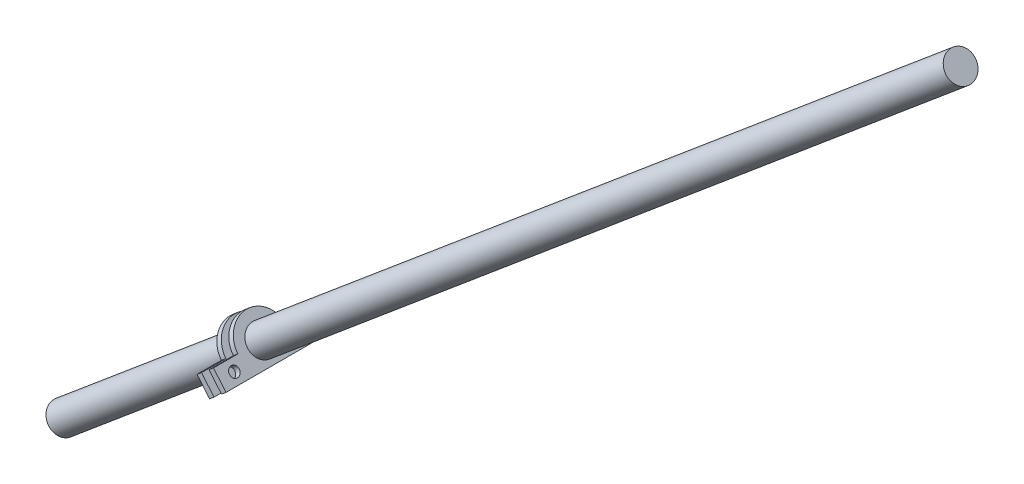
ISO-10303-21;
HEADER;
FILE_DESCRIPTION(('STEP AP214'),'2;1');
FILE_NAME('part.step','',(''),(''),'','','');
FILE_SCHEMA(('AUTOMOTIVE_DESIGN { 1 0 10303 214 1 1 1 1 }'));
ENDSEC;
DATA;
#1=APPLICATION_CONTEXT('core data for automotive mechanical design processes');
#2=APPLICATION_PROTOCOL_DEFINITION('international standard','automotive_design',2000,#1);
#3=PRODUCT_CONTEXT('',#1,'mechanical');
#4=PRODUCT('Part','Part','',(#3));
#5=PRODUCT_RELATED_PRODUCT_CATEGORY('part','',(#4));
#6=PRODUCT_DEFINITION_FORMATION('','',#4);
#7=PRODUCT_DEFINITION_CONTEXT('part definition',#1,'design');
#8=PRODUCT_DEFINITION('design','',#6,#7);
#9=PRODUCT_DEFINITION_SHAPE('','',#8);
#10=(LENGTH_UNIT() NAMED_UNIT(*) SI_UNIT(.MILLI.,.METRE.));
#11=(NAMED_UNIT(*) PLANE_ANGLE_UNIT() SI_UNIT($,.RADIAN.));
#12=(NAMED_UNIT(*) SI_UNIT($,.STERADIAN.) SOLID_ANGLE_UNIT());
#13=UNCERTAINTY_MEASURE_WITH_UNIT(LENGTH_MEASURE(1.E-05),#10,'distance_accuracy_value','');
#14=(GEOMETRIC_REPRESENTATION_CONTEXT(3) GLOBAL_UNCERTAINTY_ASSIGNED_CONTEXT((#13)) GLOBAL_UNIT_ASSIGNED_CONTEXT((#10,
#11,#12)) REPRESENTATION_CONTEXT('',''));
#15=CARTESIAN_POINT('',(0.,0.,0.));
#16=DIRECTION('',(0.,0.,1.));
#17=DIRECTION('',(1.,0.,0.));
#18=AXIS2_PLACEMENT_3D('',#15,#16,#17);
#19=CARTESIAN_POINT('',(0.,0.,0.));
#20=DIRECTION('',(0.766044443118977,0.642787609686541,0.));
#21=DIRECTION('',(-0.642787609686541,0.766044443118977,0.));
#22=AXIS2_PLACEMENT_3D('',#19,#20,#21);
#23=PLANE('',#22);
#24=CARTESIAN_POINT('',(0.,0.,0.));
#25=DIRECTION('',(0.766044443118977,0.642787609686541,0.));
#26=DIRECTION('',(-0.642787609686541,0.766044443118977,0.));
#27=AXIS2_PLACEMENT_3D('',#24,#25,#26);
#28=CIRCLE('',#27,7.5);
#29=CARTESIAN_POINT('',(-4.82090707264906,5.74533332339232,0.));
#30=VERTEX_POINT('',#29);
#31=EDGE_CURVE('E158',#30,#30,#28,.T.);
#32=ORIENTED_EDGE('',*,*,#31,.F.);
#33=EDGE_LOOP('',(#32));
#34=FACE_BOUND('',#33,.T.);
#35=ADVANCED_FACE('F47',(#34),#23,.F.);
#36=CARTESIAN_POINT('',(0.,0.,0.));
#37=DIRECTION('',(0.766044443118977,0.642787609686541,0.));
#38=DIRECTION('',(-0.642787609686541,0.766044443118977,0.));
#39=AXIS2_PLACEMENT_3D('',#36,#37,#38);
#40=CYLINDRICAL_SURFACE('',#39,7.5);
#41=CARTESIAN_POINT('',(93.4574220605152,78.420088381758,0.));
#42=DIRECTION('',(-0.766044443118977,-0.642787609686541,0.));
#43=DIRECTION('',(0.642787609686541,-0.766044443118977,0.));
#44=AXIS2_PLACEMENT_3D('',#41,#42,#43);
#45=CIRCLE('',#44,7.5);
#46=CARTESIAN_POINT('',(98.2783291331642,72.6747550583657,0.));
#47=VERTEX_POINT('',#46);
#48=EDGE_CURVE('E55',#47,#47,#45,.F.);
#49=ORIENTED_EDGE('',*,*,#48,.F.);
#50=EDGE_LOOP('',(#49));
#51=FACE_BOUND('',#50,.T.);
#52=ORIENTED_EDGE('',*,*,#31,.T.);
#53=EDGE_LOOP('',(#52));
#54=FACE_BOUND('',#53,.T.);
#55=ADVANCED_FACE('F223',(#51,#54),#40,.T.);
#56=CARTESIAN_POINT('',(93.4574220605152,78.420088381758,0.));
#57=DIRECTION('',(-0.766044443118977,-0.642787609686541,0.));
#58=DIRECTION('',(0.642787609686541,-0.766044443118977,0.));
#59=AXIS2_PLACEMENT_3D('',#56,#57,#58);
#60=PLANE('',#59);
#61=ORIENTED_EDGE('',*,*,#48,.T.);
#62=EDGE_LOOP('',(#61));
#63=FACE_BOUND('',#62,.T.);
#64=CARTESIAN_POINT('',(96.6713601089479,74.5898661661631,17.5));
#65=DIRECTION('',(-0.766044443118977,-0.642787609686541,0.));
#66=DIRECTION('',(0.642787609686541,-0.766044443118977,0.));
#67=AXIS2_PLACEMENT_3D('',#64,#65,#66);
#68=CIRCLE('',#67,2.5);
#69=CARTESIAN_POINT('',(98.2783291331642,72.6747550583657,17.5));
#70=VERTEX_POINT('',#69);
#71=EDGE_CURVE('E141',#70,#70,#68,.T.);
#72=ORIENTED_EDGE('',*,*,#71,.F.);
#73=EDGE_LOOP('',(#72));
#74=FACE_BOUND('',#73,.T.);
#75=DIRECTION('',(-0.642787609686541,0.766044443118977,0.));
#76=VECTOR('',#75,1.);
#77=CARTESIAN_POINT('',(99.8852981573806,70.7596439505682,25.));
#78=LINE('',#77,#76);
#79=CARTESIAN_POINT('',(99.8852981573806,70.7596439505682,25.));
#80=VERTEX_POINT('',#79);
#81=CARTESIAN_POINT('',(93.4574220605152,78.420088381758,25.));
#82=VERTEX_POINT('',#81);
#83=EDGE_CURVE('E148',#80,#82,#78,.T.);
#84=ORIENTED_EDGE('',*,*,#83,.T.);
#85=DIRECTION('',(0.,0.,-1.));
#86=VECTOR('',#85,1.);
#87=CARTESIAN_POINT('',(93.4574220605152,78.420088381758,25.));
#88=LINE('',#87,#86);
#89=CARTESIAN_POINT('',(93.4574220605152,78.420088381758,12.5));
#90=VERTEX_POINT('',#89);
#91=EDGE_CURVE('E102',#82,#90,#88,.T.);
#92=ORIENTED_EDGE('',*,*,#91,.T.);
#93=CARTESIAN_POINT('',(93.4574220605152,78.420088381758,0.));
#94=DIRECTION('',(-0.766044443118977,-0.642787609686541,0.));
#95=DIRECTION('',(0.642787609686541,-0.766044443118977,0.));
#96=AXIS2_PLACEMENT_3D('',#93,#94,#95);
#97=CIRCLE('',#96,12.5);
#98=CARTESIAN_POINT('',(93.4574220605152,78.420088381758,-12.5));
#99=VERTEX_POINT('',#98);
#100=EDGE_CURVE('E119',#90,#99,#97,.T.);
#101=ORIENTED_EDGE('',*,*,#100,.T.);
#102=DIRECTION('',(0.,0.,-1.));
#103=VECTOR('',#102,1.);
#104=CARTESIAN_POINT('',(93.4574220605152,78.420088381758,-25.));
#105=LINE('',#104,#103);
#106=CARTESIAN_POINT('',(93.4574220605152,78.420088381758,-25.));
#107=VERTEX_POINT('',#106);
#108=EDGE_CURVE('E112',#99,#107,#105,.T.);
#109=ORIENTED_EDGE('',*,*,#108,.T.);
#110=DIRECTION('',(0.642787609686541,-0.766044443118977,0.));
#111=VECTOR('',#110,1.);
#112=CARTESIAN_POINT('',(99.8852981573806,70.7596439505682,-25.));
#113=LINE('',#112,#111);
#114=CARTESIAN_POINT('',(99.8852981573806,70.7596439505682,-25.));
#115=VERTEX_POINT('',#114);
#116=EDGE_CURVE('E117',#107,#115,#113,.T.);
#117=ORIENTED_EDGE('',*,*,#116,.T.);
#118=DIRECTION('',(0.,0.,1.));
#119=VECTOR('',#118,1.);
#120=CARTESIAN_POINT('',(99.8852981573806,70.7596439505682,-25.));
#121=LINE('',#120,#119);
#122=EDGE_CURVE('E63',#115,#80,#121,.T.);
#123=ORIENTED_EDGE('',*,*,#122,.T.);
#124=EDGE_LOOP('',(#84,#92,#101,#109,#117,#123));
#125=FACE_BOUND('',#124,.T.);
#126=CARTESIAN_POINT('',(96.6713601089479,74.5898661661631,-17.5));
#127=DIRECTION('',(-0.766044443118977,-0.642787609686541,0.));
#128=DIRECTION('',(-0.642787609686541,0.766044443118977,0.));
#129=AXIS2_PLACEMENT_3D('',#126,#127,#128);
#130=CIRCLE('',#129,2.5);
#131=CARTESIAN_POINT('',(95.0643910847315,76.5049772739605,-17.5));
#132=VERTEX_POINT('',#131);
#133=EDGE_CURVE('E174',#132,#132,#130,.T.);
#134=ORIENTED_EDGE('',*,*,#133,.F.);
#135=EDGE_LOOP('',(#134));
#136=FACE_BOUND('',#135,.T.);
#137=ADVANCED_FACE('F114',(#63,#74,#125,#136),#60,.T.);
#138=CARTESIAN_POINT('',(95.7555553898721,80.3484512108176,0.));
#139=DIRECTION('',(-0.766044443118977,-0.642787609686541,0.));
#140=DIRECTION('',(0.642787609686541,-0.766044443118977,0.));
#141=AXIS2_PLACEMENT_3D('',#138,#139,#140);
#142=PLANE('',#141);
#143=CARTESIAN_POINT('',(95.7555553898721,80.3484512108176,0.));
#144=DIRECTION('',(-0.766044443118977,-0.642787609686541,0.));
#145=DIRECTION('',(0.642787609686541,-0.766044443118977,0.));
#146=AXIS2_PLACEMENT_3D('',#143,#144,#145);
#147=CIRCLE('',#146,7.5);
#148=CARTESIAN_POINT('',(100.576462462521,74.6031178874253,0.));
#149=VERTEX_POINT('',#148);
#150=EDGE_CURVE('E157',#149,#149,#147,.F.);
#151=ORIENTED_EDGE('',*,*,#150,.F.);
#152=EDGE_LOOP('',(#151));
#153=FACE_BOUND('',#152,.T.);
#154=DIRECTION('',(-0.642787609686541,0.766044443118977,0.));
#155=VECTOR('',#154,1.);
#156=CARTESIAN_POINT('',(102.183431486738,72.6880067796279,25.));
#157=LINE('',#156,#155);
#158=CARTESIAN_POINT('',(102.183431486738,72.6880067796279,25.));
#159=VERTEX_POINT('',#158);
#160=CARTESIAN_POINT('',(95.7555553898721,80.3484512108176,25.));
#161=VERTEX_POINT('',#160);
#162=EDGE_CURVE('E137',#159,#161,#157,.T.);
#163=ORIENTED_EDGE('',*,*,#162,.F.);
#164=DIRECTION('',(0.,0.,1.));
#165=VECTOR('',#164,1.);
#166=CARTESIAN_POINT('',(102.183431486738,72.6880067796279,-25.));
#167=LINE('',#166,#165);
#168=CARTESIAN_POINT('',(102.183431486738,72.6880067796279,-25.));
#169=VERTEX_POINT('',#168);
#170=EDGE_CURVE('E93',#169,#159,#167,.T.);
#171=ORIENTED_EDGE('',*,*,#170,.F.);
#172=DIRECTION('',(0.642787609686541,-0.766044443118977,0.));
#173=VECTOR('',#172,1.);
#174=CARTESIAN_POINT('',(102.183431486738,72.6880067796279,-25.));
#175=LINE('',#174,#173);
#176=CARTESIAN_POINT('',(95.7555553898721,80.3484512108176,-25.));
#177=VERTEX_POINT('',#176);
#178=EDGE_CURVE('E87',#177,#169,#175,.T.);
#179=ORIENTED_EDGE('',*,*,#178,.F.);
#180=DIRECTION('',(0.,0.,-1.));
#181=VECTOR('',#180,1.);
#182=CARTESIAN_POINT('',(95.7555553898721,80.3484512108176,-25.));
#183=LINE('',#182,#181);
#184=CARTESIAN_POINT('',(95.7555553898721,80.3484512108176,-12.5));
#185=VERTEX_POINT('',#184);
#186=EDGE_CURVE('E127',#185,#177,#183,.T.);
#187=ORIENTED_EDGE('',*,*,#186,.F.);
#188=CARTESIAN_POINT('',(95.7555553898721,80.3484512108176,0.));
#189=DIRECTION('',(-0.766044443118977,-0.642787609686541,0.));
#190=DIRECTION('',(0.642787609686541,-0.766044443118977,0.));
#191=AXIS2_PLACEMENT_3D('',#188,#189,#190);
#192=CIRCLE('',#191,12.5);
#193=CARTESIAN_POINT('',(95.7555553898721,80.3484512108176,12.5));
#194=VERTEX_POINT('',#193);
#195=EDGE_CURVE('E143',#194,#185,#192,.T.);
#196=ORIENTED_EDGE('',*,*,#195,.F.);
#197=DIRECTION('',(0.,0.,-1.));
#198=VECTOR('',#197,1.);
#199=CARTESIAN_POINT('',(95.7555553898721,80.3484512108176,25.));
#200=LINE('',#199,#198);
#201=EDGE_CURVE('E140',#161,#194,#200,.T.);
#202=ORIENTED_EDGE('',*,*,#201,.F.);
#203=EDGE_LOOP('',(#163,#171,#179,#187,#196,#202));
#204=FACE_BOUND('',#203,.T.);
#205=CARTESIAN_POINT('',(98.9694934383048,76.5182289952227,17.5));
#206=DIRECTION('',(-0.766044443118977,-0.642787609686541,0.));
#207=DIRECTION('',(0.642787609686541,-0.766044443118977,0.));
#208=AXIS2_PLACEMENT_3D('',#205,#206,#207);
#209=CIRCLE('',#208,2.5);
#210=CARTESIAN_POINT('',(100.576462462521,74.6031178874253,17.5));
#211=VERTEX_POINT('',#210);
#212=EDGE_CURVE('E191',#211,#211,#209,.T.);
#213=ORIENTED_EDGE('',*,*,#212,.T.);
#214=EDGE_LOOP('',(#213));
#215=FACE_BOUND('',#214,.T.);
#216=CARTESIAN_POINT('',(98.9694934383048,76.5182289952227,-17.5));
#217=DIRECTION('',(-0.766044443118977,-0.642787609686541,0.));
#218=DIRECTION('',(-0.642787609686541,0.766044443118977,0.));
#219=AXIS2_PLACEMENT_3D('',#216,#217,#218);
#220=CIRCLE('',#219,2.5);
#221=CARTESIAN_POINT('',(97.3625244140885,78.4333401030202,-17.5));
#222=VERTEX_POINT('',#221);
#223=EDGE_CURVE('E169',#222,#222,#220,.T.);
#224=ORIENTED_EDGE('',*,*,#223,.T.);
#225=EDGE_LOOP('',(#224));
#226=FACE_BOUND('',#225,.T.);
#227=ADVANCED_FACE('F206',(#153,#204,#215,#226),#142,.F.);
#228=CARTESIAN_POINT('',(99.8852981573806,70.7596439505682,25.));
#229=DIRECTION('',(0.,0.,-1.));
#230=DIRECTION('',(-1.,0.,0.));
#231=AXIS2_PLACEMENT_3D('',#228,#229,#230);
#232=PLANE('',#231);
#233=ORIENTED_EDGE('',*,*,#162,.T.);
#234=DIRECTION('',(0.766044443118977,0.642787609686541,0.));
#235=VECTOR('',#234,1.);
#236=CARTESIAN_POINT('',(93.4574220605152,78.420088381758,25.));
#237=LINE('',#236,#235);
#238=EDGE_CURVE('E155',#82,#161,#237,.T.);
#239=ORIENTED_EDGE('',*,*,#238,.F.);
#240=ORIENTED_EDGE('',*,*,#83,.F.);
#241=DIRECTION('',(0.766044443118977,0.642787609686541,0.));
#242=VECTOR('',#241,1.);
#243=CARTESIAN_POINT('',(99.8852981573806,70.7596439505682,25.));
#244=LINE('',#243,#242);
#245=EDGE_CURVE('E133',#80,#159,#244,.T.);
#246=ORIENTED_EDGE('',*,*,#245,.T.);
#247=EDGE_LOOP('',(#233,#239,#240,#246));
#248=FACE_BOUND('',#247,.T.);
#249=ADVANCED_FACE('F209',(#248),#232,.F.);
#250=CARTESIAN_POINT('',(93.4574220605152,78.420088381758,25.));
#251=DIRECTION('',(0.642787609686541,-0.766044443118977,0.));
#252=DIRECTION('',(0.766044443118977,0.642787609686541,0.));
#253=AXIS2_PLACEMENT_3D('',#250,#251,#252);
#254=PLANE('',#253);
#255=ORIENTED_EDGE('',*,*,#201,.T.);
#256=DIRECTION('',(0.766044443118977,0.642787609686541,0.));
#257=VECTOR('',#256,1.);
#258=CARTESIAN_POINT('',(93.4574220605152,78.420088381758,12.5));
#259=LINE('',#258,#257);
#260=EDGE_CURVE('E152',#90,#194,#259,.T.);
#261=ORIENTED_EDGE('',*,*,#260,.F.);
#262=ORIENTED_EDGE('',*,*,#91,.F.);
#263=ORIENTED_EDGE('',*,*,#238,.T.);
#264=EDGE_LOOP('',(#255,#261,#262,#263));
#265=FACE_BOUND('',#264,.T.);
#266=ADVANCED_FACE('F200',(#265),#254,.F.);
#267=CARTESIAN_POINT('',(93.4574220605152,78.420088381758,0.));
#268=DIRECTION('',(0.766044443118977,0.642787609686541,0.));
#269=DIRECTION('',(-0.642787609686541,0.766044443118977,0.));
#270=AXIS2_PLACEMENT_3D('',#267,#268,#269);
#271=CYLINDRICAL_SURFACE('',#270,12.5);
#272=ORIENTED_EDGE('',*,*,#195,.T.);
#273=DIRECTION('',(0.766044443118977,0.642787609686541,0.));
#274=VECTOR('',#273,1.);
#275=CARTESIAN_POINT('',(93.4574220605152,78.420088381758,-12.5));
#276=LINE('',#275,#274);
#277=EDGE_CURVE('E128',#99,#185,#276,.T.);
#278=ORIENTED_EDGE('',*,*,#277,.F.);
#279=ORIENTED_EDGE('',*,*,#100,.F.);
#280=ORIENTED_EDGE('',*,*,#260,.T.);
#281=EDGE_LOOP('',(#272,#278,#279,#280));
#282=FACE_BOUND('',#281,.T.);
#283=ADVANCED_FACE('F203',(#282),#271,.T.);
#284=CARTESIAN_POINT('',(93.4574220605152,78.420088381758,-25.));
#285=DIRECTION('',(0.642787609686541,-0.766044443118977,0.));
#286=DIRECTION('',(0.766044443118977,0.642787609686541,0.));
#287=AXIS2_PLACEMENT_3D('',#284,#285,#286);
#288=PLANE('',#287);
#289=ORIENTED_EDGE('',*,*,#186,.T.);
#290=DIRECTION('',(0.766044443118977,0.642787609686541,0.));
#291=VECTOR('',#290,1.);
#292=CARTESIAN_POINT('',(93.4574220605152,78.420088381758,-25.));
#293=LINE('',#292,#291);
#294=EDGE_CURVE('E124',#107,#177,#293,.T.);
#295=ORIENTED_EDGE('',*,*,#294,.F.);
#296=ORIENTED_EDGE('',*,*,#108,.F.);
#297=ORIENTED_EDGE('',*,*,#277,.T.);
#298=EDGE_LOOP('',(#289,#295,#296,#297));
#299=FACE_BOUND('',#298,.T.);
#300=ADVANCED_FACE('F125',(#299),#288,.F.);
#301=CARTESIAN_POINT('',(99.8852981573806,70.7596439505682,-25.));
#302=DIRECTION('',(0.,0.,1.));
#303=DIRECTION('',(1.,0.,0.));
#304=AXIS2_PLACEMENT_3D('',#301,#302,#303);
#305=PLANE('',#304);
#306=ORIENTED_EDGE('',*,*,#178,.T.);
#307=DIRECTION('',(0.766044443118977,0.642787609686541,0.));
#308=VECTOR('',#307,1.);
#309=CARTESIAN_POINT('',(99.8852981573806,70.7596439505682,-25.));
#310=LINE('',#309,#308);
#311=EDGE_CURVE('E129',#115,#169,#310,.T.);
#312=ORIENTED_EDGE('',*,*,#311,.F.);
#313=ORIENTED_EDGE('',*,*,#116,.F.);
#314=ORIENTED_EDGE('',*,*,#294,.T.);
#315=EDGE_LOOP('',(#306,#312,#313,#314));
#316=FACE_BOUND('',#315,.T.);
#317=ADVANCED_FACE('F131',(#316),#305,.F.);
#318=CARTESIAN_POINT('',(99.8852981573806,70.7596439505682,-25.));
#319=DIRECTION('',(-0.642787609686541,0.766044443118977,0.));
#320=DIRECTION('',(-0.766044443118977,-0.642787609686541,0.));
#321=AXIS2_PLACEMENT_3D('',#318,#319,#320);
#322=PLANE('',#321);
#323=ORIENTED_EDGE('',*,*,#170,.T.);
#324=ORIENTED_EDGE('',*,*,#245,.F.);
#325=ORIENTED_EDGE('',*,*,#122,.F.);
#326=ORIENTED_EDGE('',*,*,#311,.T.);
#327=EDGE_LOOP('',(#323,#324,#325,#326));
#328=FACE_BOUND('',#327,.T.);
#329=ADVANCED_FACE('F210',(#328),#322,.F.);
#330=CARTESIAN_POINT('',(96.6713601089479,74.5898661661631,17.5));
#331=DIRECTION('',(0.766044443118977,0.642787609686541,0.));
#332=DIRECTION('',(-0.642787609686541,0.766044443118977,0.));
#333=AXIS2_PLACEMENT_3D('',#330,#331,#332);
#334=CYLINDRICAL_SURFACE('',#333,2.5);
#335=ORIENTED_EDGE('',*,*,#71,.T.);
#336=EDGE_LOOP('',(#335));
#337=FACE_BOUND('',#336,.T.);
#338=ORIENTED_EDGE('',*,*,#212,.F.);
#339=EDGE_LOOP('',(#338));
#340=FACE_BOUND('',#339,.T.);
#341=ADVANCED_FACE('F212',(#337,#340),#334,.F.);
#342=CARTESIAN_POINT('',(96.6713601089479,74.5898661661631,-17.5));
#343=DIRECTION('',(0.766044443118977,0.642787609686541,0.));
#344=DIRECTION('',(-0.642787609686541,0.766044443118977,0.));
#345=AXIS2_PLACEMENT_3D('',#342,#343,#344);
#346=CYLINDRICAL_SURFACE('',#345,2.5);
#347=ORIENTED_EDGE('',*,*,#133,.T.);
#348=EDGE_LOOP('',(#347));
#349=FACE_BOUND('',#348,.T.);
#350=ORIENTED_EDGE('',*,*,#223,.F.);
#351=EDGE_LOOP('',(#350));
#352=FACE_BOUND('',#351,.T.);
#353=ADVANCED_FACE('F218',(#349,#352),#346,.F.);
#354=CARTESIAN_POINT('',(99.585777605467,83.5623892592504,0.));
#355=DIRECTION('',(-0.766044443118977,-0.642787609686541,0.));
#356=DIRECTION('',(0.642787609686541,-0.766044443118977,0.));
#357=AXIS2_PLACEMENT_3D('',#354,#355,#356);
#358=CIRCLE('',#357,7.5);
#359=CARTESIAN_POINT('',(104.406684678116,77.817055935858,0.));
#360=VERTEX_POINT('',#359);
#361=EDGE_CURVE('E12',#360,#360,#358,.F.);
#362=ORIENTED_EDGE('',*,*,#361,.F.);
#363=EDGE_LOOP('',(#362));
#364=FACE_BOUND('',#363,.T.);
#365=ORIENTED_EDGE('',*,*,#150,.T.);
#366=EDGE_LOOP('',(#365));
#367=FACE_BOUND('',#366,.T.);
#368=ADVANCED_FACE('F228',(#364,#367),#40,.T.);
#369=CARTESIAN_POINT('',(99.585777605467,83.5623892592503,0.));
#370=DIRECTION('',(-0.766044443118977,-0.642787609686541,0.));
#371=DIRECTION('',(0.642787609686541,-0.766044443118977,0.));
#372=AXIS2_PLACEMENT_3D('',#369,#370,#371);
#373=PLANE('',#372);
#374=ORIENTED_EDGE('',*,*,#361,.T.);
#375=EDGE_LOOP('',(#374));
#376=FACE_BOUND('',#375,.T.);
#377=CARTESIAN_POINT('',(102.7997156539,79.7321670436555,17.5));
#378=DIRECTION('',(-0.766044443118977,-0.642787609686541,0.));
#379=DIRECTION('',(0.642787609686541,-0.766044443118977,0.));
#380=AXIS2_PLACEMENT_3D('',#377,#378,#379);
#381=CIRCLE('',#380,2.5);
#382=CARTESIAN_POINT('',(104.406684678116,77.817055935858,17.5));
#383=VERTEX_POINT('',#382);
#384=EDGE_CURVE('E312',#383,#383,#381,.T.);
#385=ORIENTED_EDGE('',*,*,#384,.F.);
#386=EDGE_LOOP('',(#385));
#387=FACE_BOUND('',#386,.T.);
#388=DIRECTION('',(-0.642787609686541,0.766044443118977,0.));
#389=VECTOR('',#388,1.);
#390=CARTESIAN_POINT('',(106.013653702332,75.9019448280606,25.));
#391=LINE('',#390,#389);
#392=CARTESIAN_POINT('',(106.013653702332,75.9019448280606,25.));
#393=VERTEX_POINT('',#392);
#394=CARTESIAN_POINT('',(99.585777605467,83.5623892592503,25.));
#395=VERTEX_POINT('',#394);
#396=EDGE_CURVE('E318',#393,#395,#391,.T.);
#397=ORIENTED_EDGE('',*,*,#396,.T.);
#398=DIRECTION('',(0.,0.,-1.));
#399=VECTOR('',#398,1.);
#400=CARTESIAN_POINT('',(99.585777605467,83.5623892592503,25.));
#401=LINE('',#400,#399);
#402=CARTESIAN_POINT('',(99.585777605467,83.5623892592503,12.5));
#403=VERTEX_POINT('',#402);
#404=EDGE_CURVE('E321',#395,#403,#401,.T.);
#405=ORIENTED_EDGE('',*,*,#404,.T.);
#406=CARTESIAN_POINT('',(99.585777605467,83.5623892592503,0.));
#407=DIRECTION('',(-0.766044443118977,-0.642787609686541,0.));
#408=DIRECTION('',(0.642787609686541,-0.766044443118977,0.));
#409=AXIS2_PLACEMENT_3D('',#406,#407,#408);
#410=CIRCLE('',#409,12.5);
#411=CARTESIAN_POINT('',(99.585777605467,83.5623892592503,-12.5));
#412=VERTEX_POINT('',#411);
#413=EDGE_CURVE('E325',#403,#412,#410,.T.);
#414=ORIENTED_EDGE('',*,*,#413,.T.);
#415=DIRECTION('',(0.,0.,-1.));
#416=VECTOR('',#415,1.);
#417=CARTESIAN_POINT('',(99.585777605467,83.5623892592503,-25.));
#418=LINE('',#417,#416);
#419=CARTESIAN_POINT('',(99.585777605467,83.5623892592503,-25.));
#420=VERTEX_POINT('',#419);
#421=EDGE_CURVE('E328',#412,#420,#418,.T.);
#422=ORIENTED_EDGE('',*,*,#421,.T.);
#423=DIRECTION('',(0.642787609686541,-0.766044443118977,0.));
#424=VECTOR('',#423,1.);
#425=CARTESIAN_POINT('',(106.013653702332,75.9019448280606,-25.));
#426=LINE('',#425,#424);
#427=CARTESIAN_POINT('',(106.013653702332,75.9019448280606,-25.));
#428=VERTEX_POINT('',#427);
#429=EDGE_CURVE('E331',#420,#428,#426,.T.);
#430=ORIENTED_EDGE('',*,*,#429,.T.);
#431=DIRECTION('',(0.,0.,1.));
#432=VECTOR('',#431,1.);
#433=CARTESIAN_POINT('',(106.013653702332,75.9019448280606,-25.));
#434=LINE('',#433,#432);
#435=EDGE_CURVE('E334',#428,#393,#434,.T.);
#436=ORIENTED_EDGE('',*,*,#435,.T.);
#437=EDGE_LOOP('',(#397,#405,#414,#422,#430,#436));
#438=FACE_BOUND('',#437,.T.);
#439=CARTESIAN_POINT('',(102.7997156539,79.7321670436555,-17.5));
#440=DIRECTION('',(-0.766044443118977,-0.642787609686541,0.));
#441=DIRECTION('',(-0.642787609686541,0.766044443118977,0.));
#442=AXIS2_PLACEMENT_3D('',#439,#440,#441);
#443=CIRCLE('',#442,2.5);
#444=CARTESIAN_POINT('',(101.192746629683,81.6472781514529,-17.5));
#445=VERTEX_POINT('',#444);
#446=EDGE_CURVE('E303',#445,#445,#443,.T.);
#447=ORIENTED_EDGE('',*,*,#446,.F.);
#448=EDGE_LOOP('',(#447));
#449=FACE_BOUND('',#448,.T.);
#450=ADVANCED_FACE('F244',(#376,#387,#438,#449),#373,.T.);
#451=CARTESIAN_POINT('',(101.883910934824,85.49075208831,0.));
#452=DIRECTION('',(-0.766044443118977,-0.642787609686541,0.));
#453=DIRECTION('',(0.642787609686541,-0.766044443118977,0.));
#454=AXIS2_PLACEMENT_3D('',#451,#452,#453);
#455=PLANE('',#454);
#456=CARTESIAN_POINT('',(101.883910934824,85.49075208831,0.));
#457=DIRECTION('',(-0.766044443118977,-0.642787609686541,0.));
#458=DIRECTION('',(0.642787609686541,-0.766044443118977,0.));
#459=AXIS2_PLACEMENT_3D('',#456,#457,#458);
#460=CIRCLE('',#459,7.5);
#461=CARTESIAN_POINT('',(106.704818007473,79.7454187649177,0.));
#462=VERTEX_POINT('',#461);
#463=EDGE_CURVE('E167',#462,#462,#460,.F.);
#464=ORIENTED_EDGE('',*,*,#463,.F.);
#465=EDGE_LOOP('',(#464));
#466=FACE_BOUND('',#465,.T.);
#467=DIRECTION('',(-0.642787609686541,0.766044443118977,0.));
#468=VECTOR('',#467,1.);
#469=CARTESIAN_POINT('',(108.311787031689,77.8303076571202,25.));
#470=LINE('',#469,#468);
#471=CARTESIAN_POINT('',(108.311787031689,77.8303076571202,25.));
#472=VERTEX_POINT('',#471);
#473=CARTESIAN_POINT('',(101.883910934824,85.49075208831,25.));
#474=VERTEX_POINT('',#473);
#475=EDGE_CURVE('E315',#472,#474,#470,.T.);
#476=ORIENTED_EDGE('',*,*,#475,.F.);
#477=DIRECTION('',(0.,0.,1.));
#478=VECTOR('',#477,1.);
#479=CARTESIAN_POINT('',(108.311787031689,77.8303076571202,-25.));
#480=LINE('',#479,#478);
#481=CARTESIAN_POINT('',(108.311787031689,77.8303076571202,-25.));
#482=VERTEX_POINT('',#481);
#483=EDGE_CURVE('E322',#482,#472,#480,.T.);
#484=ORIENTED_EDGE('',*,*,#483,.F.);
#485=DIRECTION('',(0.642787609686541,-0.766044443118977,0.));
#486=VECTOR('',#485,1.);
#487=CARTESIAN_POINT('',(108.311787031689,77.8303076571202,-25.));
#488=LINE('',#487,#486);
#489=CARTESIAN_POINT('',(101.883910934824,85.49075208831,-25.));
#490=VERTEX_POINT('',#489);
#491=EDGE_CURVE('E347',#490,#482,#488,.T.);
#492=ORIENTED_EDGE('',*,*,#491,.F.);
#493=DIRECTION('',(0.,0.,-1.));
#494=VECTOR('',#493,1.);
#495=CARTESIAN_POINT('',(101.883910934824,85.49075208831,-25.));
#496=LINE('',#495,#494);
#497=CARTESIAN_POINT('',(101.883910934824,85.49075208831,-12.5));
#498=VERTEX_POINT('',#497);
#499=EDGE_CURVE('E344',#498,#490,#496,.T.);
#500=ORIENTED_EDGE('',*,*,#499,.F.);
#501=CARTESIAN_POINT('',(101.883910934824,85.49075208831,0.));
#502=DIRECTION('',(-0.766044443118977,-0.642787609686541,0.));
#503=DIRECTION('',(0.642787609686541,-0.766044443118977,0.));
#504=AXIS2_PLACEMENT_3D('',#501,#502,#503);
#505=CIRCLE('',#504,12.5);
#506=CARTESIAN_POINT('',(101.883910934824,85.49075208831,12.5));
#507=VERTEX_POINT('',#506);
#508=EDGE_CURVE('E341',#507,#498,#505,.T.);
#509=ORIENTED_EDGE('',*,*,#508,.F.);
#510=DIRECTION('',(0.,0.,-1.));
#511=VECTOR('',#510,1.);
#512=CARTESIAN_POINT('',(101.883910934824,85.49075208831,25.));
#513=LINE('',#512,#511);
#514=EDGE_CURVE('E339',#474,#507,#513,.T.);
#515=ORIENTED_EDGE('',*,*,#514,.F.);
#516=EDGE_LOOP('',(#476,#484,#492,#500,#509,#515));
#517=FACE_BOUND('',#516,.T.);
#518=CARTESIAN_POINT('',(105.097848983257,81.6605298727151,17.5));
#519=DIRECTION('',(-0.766044443118977,-0.642787609686541,0.));
#520=DIRECTION('',(0.642787609686541,-0.766044443118977,0.));
#521=AXIS2_PLACEMENT_3D('',#518,#519,#520);
#522=CIRCLE('',#521,2.5);
#523=CARTESIAN_POINT('',(106.704818007473,79.7454187649176,17.5));
#524=VERTEX_POINT('',#523);
#525=EDGE_CURVE('E309',#524,#524,#522,.T.);
#526=ORIENTED_EDGE('',*,*,#525,.T.);
#527=EDGE_LOOP('',(#526));
#528=FACE_BOUND('',#527,.T.);
#529=CARTESIAN_POINT('',(105.097848983257,81.6605298727151,-17.5));
#530=DIRECTION('',(-0.766044443118977,-0.642787609686541,0.));
#531=DIRECTION('',(-0.642787609686541,0.766044443118977,0.));
#532=AXIS2_PLACEMENT_3D('',#529,#530,#531);
#533=CIRCLE('',#532,2.5);
#534=CARTESIAN_POINT('',(103.49087995904,83.5756409805125,-17.5));
#535=VERTEX_POINT('',#534);
#536=EDGE_CURVE('E306',#535,#535,#533,.T.);
#537=ORIENTED_EDGE('',*,*,#536,.T.);
#538=EDGE_LOOP('',(#537));
#539=FACE_BOUND('',#538,.T.);
#540=ADVANCED_FACE('F250',(#466,#517,#528,#539),#455,.F.);
#541=CARTESIAN_POINT('',(106.013653702332,75.9019448280606,25.));
#542=DIRECTION('',(0.,0.,-1.));
#543=DIRECTION('',(-1.,0.,0.));
#544=AXIS2_PLACEMENT_3D('',#541,#542,#543);
#545=PLANE('',#544);
#546=ORIENTED_EDGE('',*,*,#475,.T.);
#547=DIRECTION('',(0.766044443118977,0.642787609686541,0.));
#548=VECTOR('',#547,1.);
#549=CARTESIAN_POINT('',(99.585777605467,83.5623892592503,25.));
#550=LINE('',#549,#548);
#551=EDGE_CURVE('E170',#395,#474,#550,.T.);
#552=ORIENTED_EDGE('',*,*,#551,.F.);
#553=ORIENTED_EDGE('',*,*,#396,.F.);
#554=DIRECTION('',(0.766044443118977,0.642787609686541,0.));
#555=VECTOR('',#554,1.);
#556=CARTESIAN_POINT('',(106.013653702332,75.9019448280606,25.));
#557=LINE('',#556,#555);
#558=EDGE_CURVE('E337',#393,#472,#557,.T.);
#559=ORIENTED_EDGE('',*,*,#558,.T.);
#560=EDGE_LOOP('',(#546,#552,#553,#559));
#561=FACE_BOUND('',#560,.T.);
#562=ADVANCED_FACE('F264',(#561),#545,.F.);
#563=CARTESIAN_POINT('',(99.585777605467,83.5623892592503,25.));
#564=DIRECTION('',(0.642787609686541,-0.766044443118977,0.));
#565=DIRECTION('',(0.766044443118977,0.642787609686541,0.));
#566=AXIS2_PLACEMENT_3D('',#563,#564,#565);
#567=PLANE('',#566);
#568=ORIENTED_EDGE('',*,*,#514,.T.);
#569=DIRECTION('',(0.766044443118977,0.642787609686541,0.));
#570=VECTOR('',#569,1.);
#571=CARTESIAN_POINT('',(99.585777605467,83.5623892592503,12.5));
#572=LINE('',#571,#570);
#573=EDGE_CURVE('E177',#403,#507,#572,.T.);
#574=ORIENTED_EDGE('',*,*,#573,.F.);
#575=ORIENTED_EDGE('',*,*,#404,.F.);
#576=ORIENTED_EDGE('',*,*,#551,.T.);
#577=EDGE_LOOP('',(#568,#574,#575,#576));
#578=FACE_BOUND('',#577,.T.);
#579=ADVANCED_FACE('F267',(#578),#567,.F.);
#580=CARTESIAN_POINT('',(99.585777605467,83.5623892592503,0.));
#581=DIRECTION('',(0.766044443118977,0.642787609686541,0.));
#582=DIRECTION('',(-0.642787609686541,0.766044443118977,0.));
#583=AXIS2_PLACEMENT_3D('',#580,#581,#582);
#584=CYLINDRICAL_SURFACE('',#583,12.5);
#585=ORIENTED_EDGE('',*,*,#508,.T.);
#586=DIRECTION('',(0.766044443118977,0.642787609686541,0.));
#587=VECTOR('',#586,1.);
#588=CARTESIAN_POINT('',(99.585777605467,83.5623892592503,-12.5));
#589=LINE('',#588,#587);
#590=EDGE_CURVE('E186',#412,#498,#589,.T.);
#591=ORIENTED_EDGE('',*,*,#590,.F.);
#592=ORIENTED_EDGE('',*,*,#413,.F.);
#593=ORIENTED_EDGE('',*,*,#573,.T.);
#594=EDGE_LOOP('',(#585,#591,#592,#593));
#595=FACE_BOUND('',#594,.T.);
#596=ADVANCED_FACE('F271',(#595),#584,.T.);
#597=CARTESIAN_POINT('',(99.585777605467,83.5623892592503,-25.));
#598=DIRECTION('',(0.642787609686541,-0.766044443118977,0.));
#599=DIRECTION('',(0.766044443118977,0.642787609686541,0.));
#600=AXIS2_PLACEMENT_3D('',#597,#598,#599);
#601=PLANE('',#600);
#602=ORIENTED_EDGE('',*,*,#499,.T.);
#603=DIRECTION('',(0.766044443118977,0.642787609686541,0.));
#604=VECTOR('',#603,1.);
#605=CARTESIAN_POINT('',(99.585777605467,83.5623892592503,-25.));
#606=LINE('',#605,#604);
#607=EDGE_CURVE('E357',#420,#490,#606,.T.);
#608=ORIENTED_EDGE('',*,*,#607,.F.);
#609=ORIENTED_EDGE('',*,*,#421,.F.);
#610=ORIENTED_EDGE('',*,*,#590,.T.);
#611=EDGE_LOOP('',(#602,#608,#609,#610));
#612=FACE_BOUND('',#611,.T.);
#613=ADVANCED_FACE('F274',(#612),#601,.F.);
#614=CARTESIAN_POINT('',(106.013653702332,75.9019448280606,-25.));
#615=DIRECTION('',(0.,0.,1.));
#616=DIRECTION('',(1.,0.,0.));
#617=AXIS2_PLACEMENT_3D('',#614,#615,#616);
#618=PLANE('',#617);
#619=ORIENTED_EDGE('',*,*,#491,.T.);
#620=DIRECTION('',(0.766044443118977,0.642787609686541,0.));
#621=VECTOR('',#620,1.);
#622=CARTESIAN_POINT('',(106.013653702332,75.9019448280606,-25.));
#623=LINE('',#622,#621);
#624=EDGE_CURVE('E354',#428,#482,#623,.T.);
#625=ORIENTED_EDGE('',*,*,#624,.F.);
#626=ORIENTED_EDGE('',*,*,#429,.F.);
#627=ORIENTED_EDGE('',*,*,#607,.T.);
#628=EDGE_LOOP('',(#619,#625,#626,#627));
#629=FACE_BOUND('',#628,.T.);
#630=ADVANCED_FACE('F278',(#629),#618,.F.);
#631=CARTESIAN_POINT('',(106.013653702332,75.9019448280606,-25.));
#632=DIRECTION('',(-0.642787609686541,0.766044443118977,0.));
#633=DIRECTION('',(-0.766044443118977,-0.642787609686541,0.));
#634=AXIS2_PLACEMENT_3D('',#631,#632,#633);
#635=PLANE('',#634);
#636=ORIENTED_EDGE('',*,*,#483,.T.);
#637=ORIENTED_EDGE('',*,*,#558,.F.);
#638=ORIENTED_EDGE('',*,*,#435,.F.);
#639=ORIENTED_EDGE('',*,*,#624,.T.);
#640=EDGE_LOOP('',(#636,#637,#638,#639));
#641=FACE_BOUND('',#640,.T.);
#642=ADVANCED_FACE('F282',(#641),#635,.F.);
#643=CARTESIAN_POINT('',(102.7997156539,79.7321670436555,17.5));
#644=DIRECTION('',(0.766044443118977,0.642787609686541,0.));
#645=DIRECTION('',(-0.642787609686541,0.766044443118977,0.));
#646=AXIS2_PLACEMENT_3D('',#643,#644,#645);
#647=CYLINDRICAL_SURFACE('',#646,2.5);
#648=ORIENTED_EDGE('',*,*,#384,.T.);
#649=EDGE_LOOP('',(#648));
#650=FACE_BOUND('',#649,.T.);
#651=ORIENTED_EDGE('',*,*,#525,.F.);
#652=EDGE_LOOP('',(#651));
#653=FACE_BOUND('',#652,.T.);
#654=ADVANCED_FACE('F286',(#650,#653),#647,.F.);
#655=CARTESIAN_POINT('',(102.7997156539,79.7321670436555,-17.5));
#656=DIRECTION('',(0.766044443118977,0.642787609686541,0.));
#657=DIRECTION('',(-0.642787609686541,0.766044443118977,0.));
#658=AXIS2_PLACEMENT_3D('',#655,#656,#657);
#659=CYLINDRICAL_SURFACE('',#658,2.5);
#660=ORIENTED_EDGE('',*,*,#446,.T.);
#661=EDGE_LOOP('',(#660));
#662=FACE_BOUND('',#661,.T.);
#663=ORIENTED_EDGE('',*,*,#536,.F.);
#664=EDGE_LOOP('',(#663));
#665=FACE_BOUND('',#664,.T.);
#666=ADVANCED_FACE('F293',(#662,#665),#659,.F.);
#667=CARTESIAN_POINT('',(459.626665871386,385.672565811925,0.));
#668=DIRECTION('',(0.766044443118977,0.642787609686541,0.));
#669=DIRECTION('',(-0.642787609686541,0.766044443118977,0.));
#670=AXIS2_PLACEMENT_3D('',#667,#668,#669);
#671=PLANE('',#670);
#672=CARTESIAN_POINT('',(459.626665871386,385.672565811925,0.));
#673=DIRECTION('',(0.766044443118977,0.642787609686541,0.));
#674=DIRECTION('',(-0.642787609686541,0.766044443118977,0.));
#675=AXIS2_PLACEMENT_3D('',#672,#673,#674);
#676=CIRCLE('',#675,7.5);
#677=CARTESIAN_POINT('',(454.805758798737,391.417899135317,0.));
#678=VERTEX_POINT('',#677);
#679=EDGE_CURVE('E161',#678,#678,#676,.T.);
#680=ORIENTED_EDGE('',*,*,#679,.T.);
#681=EDGE_LOOP('',(#680));
#682=FACE_BOUND('',#681,.T.);
#683=ADVANCED_FACE('F241',(#682),#671,.T.);
#684=ORIENTED_EDGE('',*,*,#679,.F.);
#685=EDGE_LOOP('',(#684));
#686=FACE_BOUND('',#685,.T.);
#687=ORIENTED_EDGE('',*,*,#463,.T.);
#688=EDGE_LOOP('',(#687));
#689=FACE_BOUND('',#688,.T.);
#690=ADVANCED_FACE('F227',(#686,#689),#40,.T.);
#691=CLOSED_SHELL('',(#35,#55,#137,#227,#249,#266,#283,#300,#317,#329,#341,#353,#368,#450,#540,
#562,#579,#596,#613,#630,#642,#654,#666,#683,#690));
#692=MANIFOLD_SOLID_BREP('B2',#691);
#693=ADVANCED_BREP_SHAPE_REPRESENTATION('',(#18,#692),#14);
#694=SHAPE_DEFINITION_REPRESENTATION(#9,#693);
ENDSEC;
END-ISO-10303-21;
